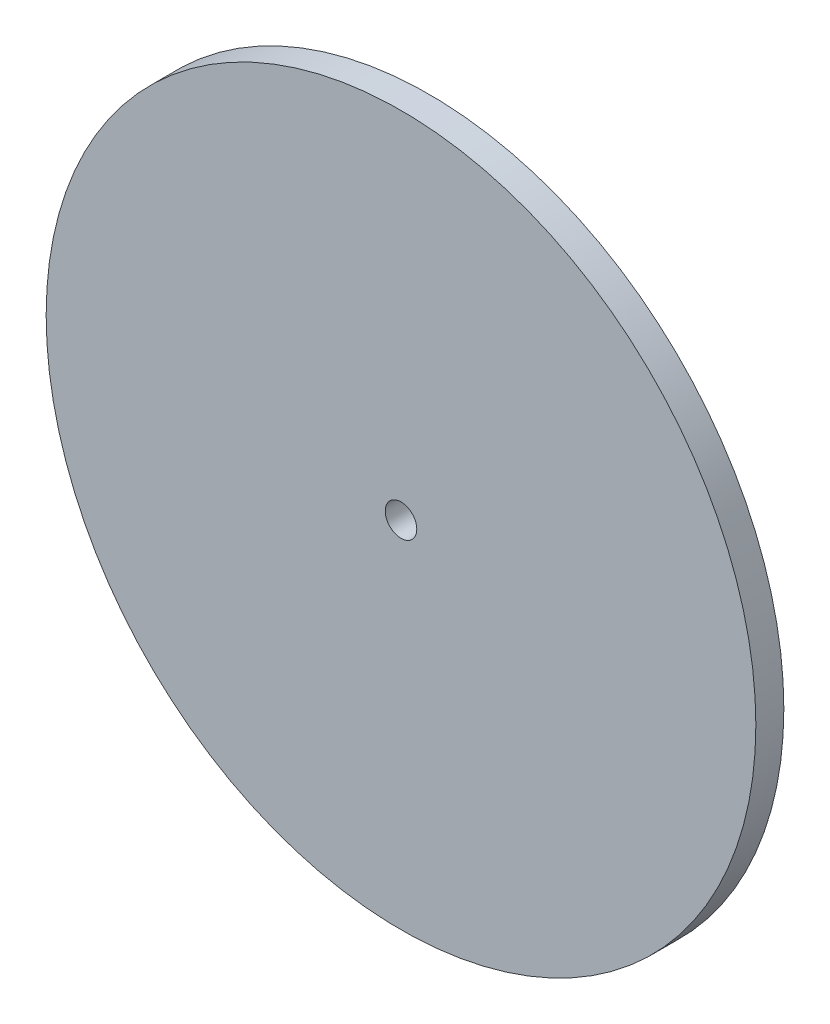
ISO-10303-21;
HEADER;
FILE_DESCRIPTION(('STEP AP214'),'2;1');
FILE_NAME('part.step','',(''),(''),'','','');
FILE_SCHEMA(('AUTOMOTIVE_DESIGN { 1 0 10303 214 1 1 1 1 }'));
ENDSEC;
DATA;
#1=APPLICATION_CONTEXT('core data for automotive mechanical design processes');
#2=APPLICATION_PROTOCOL_DEFINITION('international standard','automotive_design',2000,#1);
#3=PRODUCT_CONTEXT('',#1,'mechanical');
#4=PRODUCT('Part','Part','',(#3));
#5=PRODUCT_RELATED_PRODUCT_CATEGORY('part','',(#4));
#6=PRODUCT_DEFINITION_FORMATION('','',#4);
#7=PRODUCT_DEFINITION_CONTEXT('part definition',#1,'design');
#8=PRODUCT_DEFINITION('design','',#6,#7);
#9=PRODUCT_DEFINITION_SHAPE('','',#8);
#10=(LENGTH_UNIT() NAMED_UNIT(*) SI_UNIT(.MILLI.,.METRE.));
#11=(NAMED_UNIT(*) PLANE_ANGLE_UNIT() SI_UNIT($,.RADIAN.));
#12=(NAMED_UNIT(*) SI_UNIT($,.STERADIAN.) SOLID_ANGLE_UNIT());
#13=UNCERTAINTY_MEASURE_WITH_UNIT(LENGTH_MEASURE(1.E-05),#10,'distance_accuracy_value','');
#14=(GEOMETRIC_REPRESENTATION_CONTEXT(3) GLOBAL_UNCERTAINTY_ASSIGNED_CONTEXT((#13)) GLOBAL_UNIT_ASSIGNED_CONTEXT((#10,
#11,#12)) REPRESENTATION_CONTEXT('',''));
#15=CARTESIAN_POINT('',(0.,0.,0.));
#16=DIRECTION('',(0.,0.,1.));
#17=DIRECTION('',(1.,0.,0.));
#18=AXIS2_PLACEMENT_3D('',#15,#16,#17);
#19=CARTESIAN_POINT('',(0.,0.,3.55));
#20=DIRECTION('',(0.,0.,-1.));
#21=DIRECTION('',(-1.,0.,0.));
#22=AXIS2_PLACEMENT_3D('',#19,#20,#21);
#23=CYLINDRICAL_SURFACE('',#22,44.9999999999999);
#24=CARTESIAN_POINT('',(0.,0.,3.55));
#25=DIRECTION('',(0.,0.,1.));
#26=DIRECTION('',(1.,0.,0.));
#27=AXIS2_PLACEMENT_3D('',#24,#25,#26);
#28=CIRCLE('',#27,44.9999999999999);
#29=CARTESIAN_POINT('',(44.9999999999999,0.,3.55));
#30=VERTEX_POINT('',#29);
#31=EDGE_CURVE('E10',#30,#30,#28,.T.);
#32=ORIENTED_EDGE('',*,*,#31,.F.);
#33=EDGE_LOOP('',(#32));
#34=FACE_BOUND('',#33,.T.);
#35=CARTESIAN_POINT('',(0.,0.,0.));
#36=DIRECTION('',(0.,0.,1.));
#37=DIRECTION('',(1.,0.,0.));
#38=AXIS2_PLACEMENT_3D('',#35,#36,#37);
#39=CIRCLE('',#38,44.9999999999999);
#40=CARTESIAN_POINT('',(44.9999999999999,0.,0.));
#41=VERTEX_POINT('',#40);
#42=EDGE_CURVE('E52',#41,#41,#39,.T.);
#43=ORIENTED_EDGE('',*,*,#42,.T.);
#44=EDGE_LOOP('',(#43));
#45=FACE_BOUND('',#44,.T.);
#46=ADVANCED_FACE('F45',(#34,#45),#23,.T.);
#47=CARTESIAN_POINT('',(0.,0.,3.55));
#48=DIRECTION('',(0.,0.,1.));
#49=DIRECTION('',(1.,0.,0.));
#50=AXIS2_PLACEMENT_3D('',#47,#48,#49);
#51=PLANE('',#50);
#52=CARTESIAN_POINT('',(0.,0.,3.55));
#53=DIRECTION('',(0.,0.,1.));
#54=DIRECTION('',(1.,0.,0.));
#55=AXIS2_PLACEMENT_3D('',#52,#53,#54);
#56=CIRCLE('',#55,2.);
#57=CARTESIAN_POINT('',(2.,0.,3.55));
#58=VERTEX_POINT('',#57);
#59=EDGE_CURVE('E58',#58,#58,#56,.T.);
#60=ORIENTED_EDGE('',*,*,#59,.F.);
#61=EDGE_LOOP('',(#60));
#62=FACE_BOUND('',#61,.T.);
#63=ORIENTED_EDGE('',*,*,#31,.T.);
#64=EDGE_LOOP('',(#63));
#65=FACE_BOUND('',#64,.T.);
#66=ADVANCED_FACE('F75',(#62,#65),#51,.T.);
#67=CARTESIAN_POINT('',(0.,0.,0.));
#68=DIRECTION('',(0.,0.,1.));
#69=DIRECTION('',(1.,0.,0.));
#70=AXIS2_PLACEMENT_3D('',#67,#68,#69);
#71=PLANE('',#70);
#72=CARTESIAN_POINT('',(0.,0.,0.));
#73=DIRECTION('',(0.,0.,1.));
#74=DIRECTION('',(1.,0.,0.));
#75=AXIS2_PLACEMENT_3D('',#72,#73,#74);
#76=CIRCLE('',#75,2.);
#77=CARTESIAN_POINT('',(2.,0.,0.));
#78=VERTEX_POINT('',#77);
#79=EDGE_CURVE('E48',#78,#78,#76,.T.);
#80=ORIENTED_EDGE('',*,*,#79,.T.);
#81=EDGE_LOOP('',(#80));
#82=FACE_BOUND('',#81,.T.);
#83=ORIENTED_EDGE('',*,*,#42,.F.);
#84=EDGE_LOOP('',(#83));
#85=FACE_BOUND('',#84,.T.);
#86=ADVANCED_FACE('F65',(#82,#85),#71,.F.);
#87=CARTESIAN_POINT('',(0.,0.,-0.45));
#88=DIRECTION('',(0.,0.,1.));
#89=DIRECTION('',(1.,0.,0.));
#90=AXIS2_PLACEMENT_3D('',#87,#88,#89);
#91=CYLINDRICAL_SURFACE('',#90,2.);
#92=ORIENTED_EDGE('',*,*,#59,.T.);
#93=EDGE_LOOP('',(#92));
#94=FACE_BOUND('',#93,.T.);
#95=ORIENTED_EDGE('',*,*,#79,.F.);
#96=EDGE_LOOP('',(#95));
#97=FACE_BOUND('',#96,.T.);
#98=ADVANCED_FACE('F68',(#94,#97),#91,.F.);
#99=CLOSED_SHELL('',(#46,#66,#86,#98));
#100=MANIFOLD_SOLID_BREP('B2',#99);
#101=ADVANCED_BREP_SHAPE_REPRESENTATION('',(#18,#100),#14);
#102=SHAPE_DEFINITION_REPRESENTATION(#9,#101);
ENDSEC;
END-ISO-10303-21;
